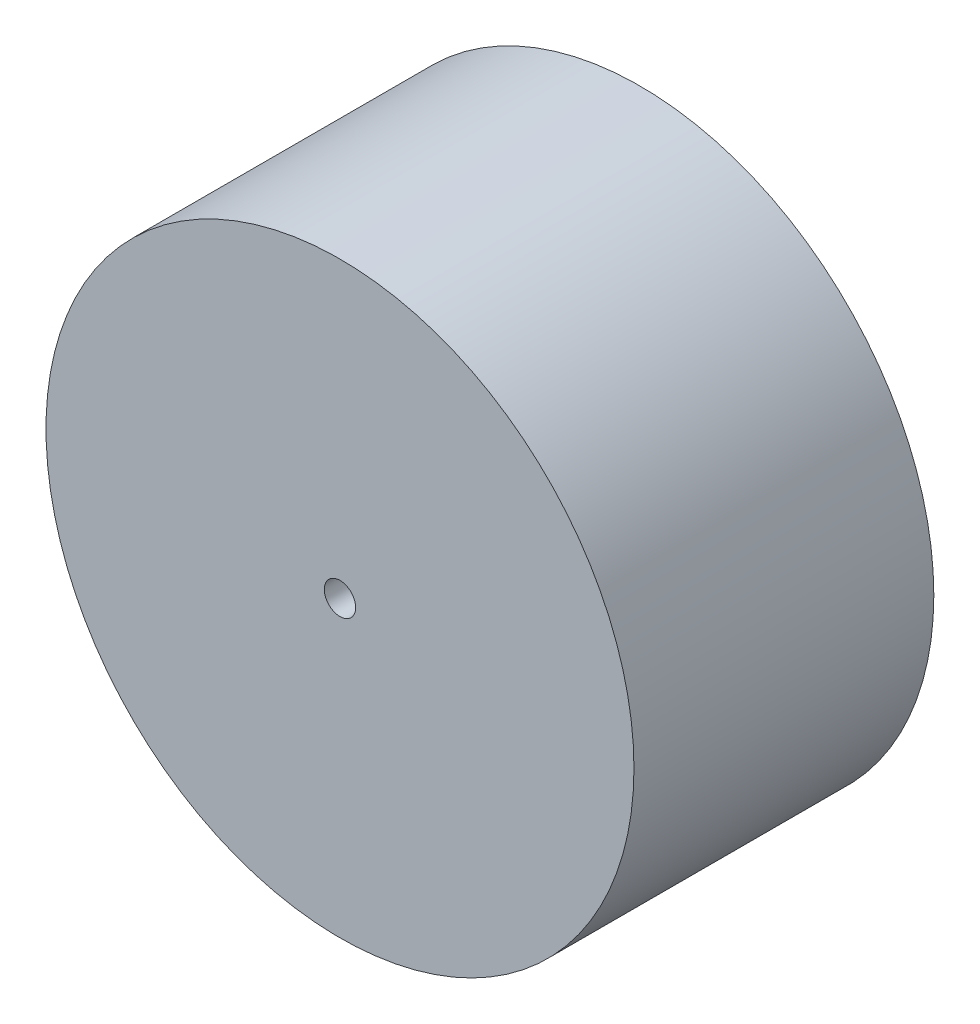
ISO-10303-21;
HEADER;
FILE_DESCRIPTION(('STEP AP214'),'2;1');
FILE_NAME('part.step','',(''),(''),'','','');
FILE_SCHEMA(('AUTOMOTIVE_DESIGN { 1 0 10303 214 1 1 1 1 }'));
ENDSEC;
DATA;
#1=APPLICATION_CONTEXT('core data for automotive mechanical design processes');
#2=APPLICATION_PROTOCOL_DEFINITION('international standard','automotive_design',2000,#1);
#3=PRODUCT_CONTEXT('',#1,'mechanical');
#4=PRODUCT('Part','Part','',(#3));
#5=PRODUCT_RELATED_PRODUCT_CATEGORY('part','',(#4));
#6=PRODUCT_DEFINITION_FORMATION('','',#4);
#7=PRODUCT_DEFINITION_CONTEXT('part definition',#1,'design');
#8=PRODUCT_DEFINITION('design','',#6,#7);
#9=PRODUCT_DEFINITION_SHAPE('','',#8);
#10=(LENGTH_UNIT() NAMED_UNIT(*) SI_UNIT(.MILLI.,.METRE.));
#11=(NAMED_UNIT(*) PLANE_ANGLE_UNIT() SI_UNIT($,.RADIAN.));
#12=(NAMED_UNIT(*) SI_UNIT($,.STERADIAN.) SOLID_ANGLE_UNIT());
#13=UNCERTAINTY_MEASURE_WITH_UNIT(LENGTH_MEASURE(1.E-05),#10,'distance_accuracy_value','');
#14=(GEOMETRIC_REPRESENTATION_CONTEXT(3) GLOBAL_UNCERTAINTY_ASSIGNED_CONTEXT((#13)) GLOBAL_UNIT_ASSIGNED_CONTEXT((#10,
#11,#12)) REPRESENTATION_CONTEXT('',''));
#15=CARTESIAN_POINT('',(0.,0.,0.));
#16=DIRECTION('',(0.,0.,1.));
#17=DIRECTION('',(1.,0.,0.));
#18=AXIS2_PLACEMENT_3D('',#15,#16,#17);
#19=CARTESIAN_POINT('',(0.,0.,30.6));
#20=DIRECTION('',(0.,0.,1.));
#21=DIRECTION('',(1.,0.,0.));
#22=AXIS2_PLACEMENT_3D('',#19,#20,#21);
#23=PLANE('',#22);
#24=CARTESIAN_POINT('',(0.,0.,30.6));
#25=DIRECTION('',(0.,0.,1.));
#26=DIRECTION('',(1.,0.,0.));
#27=AXIS2_PLACEMENT_3D('',#24,#25,#26);
#28=CIRCLE('',#27,30.);
#29=CARTESIAN_POINT('',(30.,0.,30.6));
#30=VERTEX_POINT('',#29);
#31=EDGE_CURVE('E10',#30,#30,#28,.T.);
#32=ORIENTED_EDGE('',*,*,#31,.T.);
#33=EDGE_LOOP('',(#32));
#34=FACE_BOUND('',#33,.T.);
#35=CARTESIAN_POINT('',(0.,0.,30.6));
#36=DIRECTION('',(0.,0.,1.));
#37=DIRECTION('',(1.,0.,0.));
#38=AXIS2_PLACEMENT_3D('',#35,#36,#37);
#39=CIRCLE('',#38,1.6);
#40=CARTESIAN_POINT('',(1.6,0.,30.6));
#41=VERTEX_POINT('',#40);
#42=EDGE_CURVE('E54',#41,#41,#39,.T.);
#43=ORIENTED_EDGE('',*,*,#42,.F.);
#44=EDGE_LOOP('',(#43));
#45=FACE_BOUND('',#44,.T.);
#46=ADVANCED_FACE('F41',(#34,#45),#23,.T.);
#47=CARTESIAN_POINT('',(0.,0.,0.));
#48=DIRECTION('',(0.,0.,1.));
#49=DIRECTION('',(1.,0.,0.));
#50=AXIS2_PLACEMENT_3D('',#47,#48,#49);
#51=PLANE('',#50);
#52=CARTESIAN_POINT('',(0.,0.,0.));
#53=DIRECTION('',(0.,0.,1.));
#54=DIRECTION('',(1.,0.,0.));
#55=AXIS2_PLACEMENT_3D('',#52,#53,#54);
#56=CIRCLE('',#55,30.);
#57=CARTESIAN_POINT('',(30.,0.,0.));
#58=VERTEX_POINT('',#57);
#59=EDGE_CURVE('E45',#58,#58,#56,.T.);
#60=ORIENTED_EDGE('',*,*,#59,.F.);
#61=EDGE_LOOP('',(#60));
#62=FACE_BOUND('',#61,.T.);
#63=CARTESIAN_POINT('',(0.,0.,0.));
#64=DIRECTION('',(0.,0.,1.));
#65=DIRECTION('',(1.,0.,0.));
#66=AXIS2_PLACEMENT_3D('',#63,#64,#65);
#67=CIRCLE('',#66,1.6);
#68=CARTESIAN_POINT('',(1.6,0.,0.));
#69=VERTEX_POINT('',#68);
#70=EDGE_CURVE('E56',#69,#69,#67,.T.);
#71=ORIENTED_EDGE('',*,*,#70,.T.);
#72=EDGE_LOOP('',(#71));
#73=FACE_BOUND('',#72,.T.);
#74=ADVANCED_FACE('F68',(#62,#73),#51,.F.);
#75=CARTESIAN_POINT('',(0.,0.,30.6));
#76=DIRECTION('',(0.,0.,-1.));
#77=DIRECTION('',(-1.,0.,0.));
#78=AXIS2_PLACEMENT_3D('',#75,#76,#77);
#79=CYLINDRICAL_SURFACE('',#78,30.);
#80=ORIENTED_EDGE('',*,*,#31,.F.);
#81=EDGE_LOOP('',(#80));
#82=FACE_BOUND('',#81,.T.);
#83=ORIENTED_EDGE('',*,*,#59,.T.);
#84=EDGE_LOOP('',(#83));
#85=FACE_BOUND('',#84,.T.);
#86=ADVANCED_FACE('F43',(#82,#85),#79,.T.);
#87=CARTESIAN_POINT('',(0.,0.,30.6));
#88=DIRECTION('',(0.,0.,-1.));
#89=DIRECTION('',(-1.,0.,0.));
#90=AXIS2_PLACEMENT_3D('',#87,#88,#89);
#91=CYLINDRICAL_SURFACE('',#90,1.6);
#92=ORIENTED_EDGE('',*,*,#42,.T.);
#93=EDGE_LOOP('',(#92));
#94=FACE_BOUND('',#93,.T.);
#95=ORIENTED_EDGE('',*,*,#70,.F.);
#96=EDGE_LOOP('',(#95));
#97=FACE_BOUND('',#96,.T.);
#98=ADVANCED_FACE('F64',(#94,#97),#91,.F.);
#99=CLOSED_SHELL('',(#46,#74,#86,#98));
#100=MANIFOLD_SOLID_BREP('B2',#99);
#101=ADVANCED_BREP_SHAPE_REPRESENTATION('',(#18,#100),#14);
#102=SHAPE_DEFINITION_REPRESENTATION(#9,#101);
ENDSEC;
END-ISO-10303-21;
